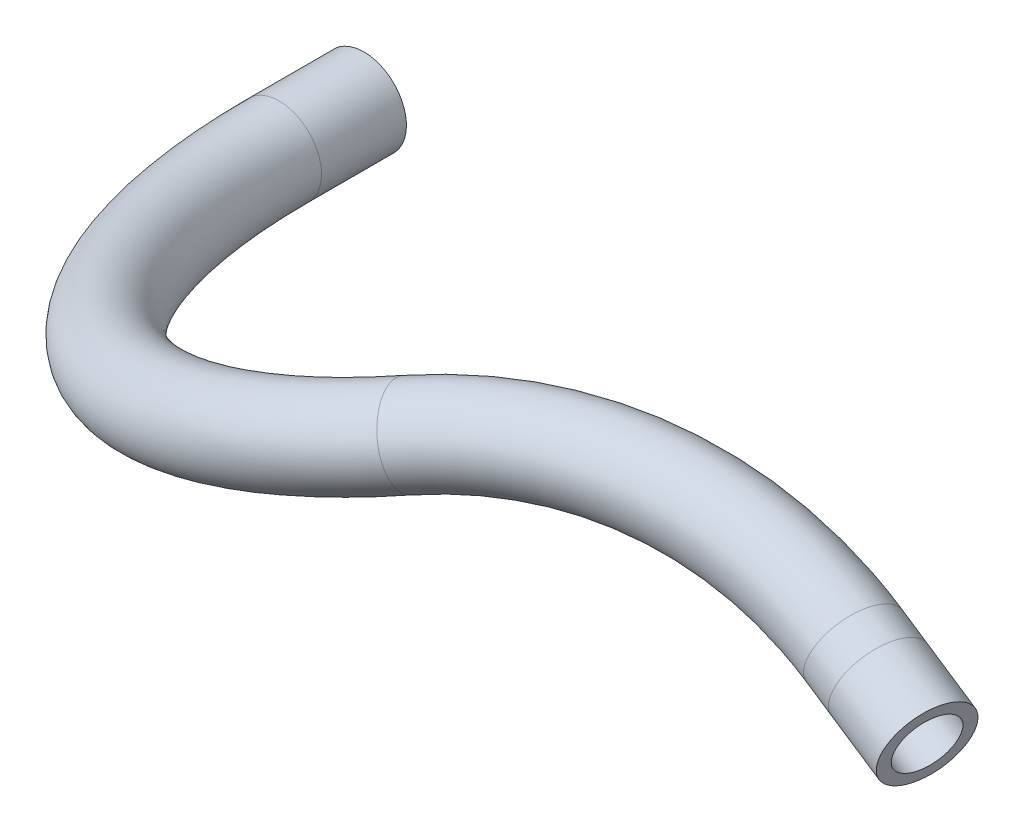
ISO-10303-21;
HEADER;
FILE_DESCRIPTION(('STEP AP214'),'2;1');
FILE_NAME('part.step','',(''),(''),'','','');
FILE_SCHEMA(('AUTOMOTIVE_DESIGN { 1 0 10303 214 1 1 1 1 }'));
ENDSEC;
DATA;
#1=APPLICATION_CONTEXT('core data for automotive mechanical design processes');
#2=APPLICATION_PROTOCOL_DEFINITION('international standard','automotive_design',2000,#1);
#3=PRODUCT_CONTEXT('',#1,'mechanical');
#4=PRODUCT('Part','Part','',(#3));
#5=PRODUCT_RELATED_PRODUCT_CATEGORY('part','',(#4));
#6=PRODUCT_DEFINITION_FORMATION('','',#4);
#7=PRODUCT_DEFINITION_CONTEXT('part definition',#1,'design');
#8=PRODUCT_DEFINITION('design','',#6,#7);
#9=PRODUCT_DEFINITION_SHAPE('','',#8);
#10=(LENGTH_UNIT() NAMED_UNIT(*) SI_UNIT(.MILLI.,.METRE.));
#11=(NAMED_UNIT(*) PLANE_ANGLE_UNIT() SI_UNIT($,.RADIAN.));
#12=(NAMED_UNIT(*) SI_UNIT($,.STERADIAN.) SOLID_ANGLE_UNIT());
#13=UNCERTAINTY_MEASURE_WITH_UNIT(LENGTH_MEASURE(1.E-05),#10,'distance_accuracy_value','');
#14=(GEOMETRIC_REPRESENTATION_CONTEXT(3) GLOBAL_UNCERTAINTY_ASSIGNED_CONTEXT((#13)) GLOBAL_UNIT_ASSIGNED_CONTEXT((#10,
#11,#12)) REPRESENTATION_CONTEXT('',''));
#15=CARTESIAN_POINT('',(0.,0.,0.));
#16=DIRECTION('',(0.,0.,1.));
#17=DIRECTION('',(1.,0.,0.));
#18=AXIS2_PLACEMENT_3D('',#15,#16,#17);
#19=CARTESIAN_POINT('',(23.4999999999999,73.,-26.9999999999999));
#20=DIRECTION('',(0.,0.,-1.));
#21=DIRECTION('',(0.414353258588674,-0.91011613385158,0.));
#22=AXIS2_PLACEMENT_3D('',#19,#20,#21);
#23=PLANE('',#22);
#24=CARTESIAN_POINT('',(23.4999999999999,73.,-26.9999999999999));
#25=DIRECTION('',(0.,0.,-1.));
#26=DIRECTION('',(-1.,0.,0.));
#27=AXIS2_PLACEMENT_3D('',#24,#25,#26);
#28=CIRCLE('',#27,9.525);
#29=CARTESIAN_POINT('',(13.9749999999999,73.,-26.9999999999999));
#30=VERTEX_POINT('',#29);
#31=EDGE_CURVE('E98',#30,#30,#28,.T.);
#32=ORIENTED_EDGE('',*,*,#31,.F.);
#33=EDGE_LOOP('',(#32));
#34=FACE_BOUND('',#33,.T.);
#35=CARTESIAN_POINT('',(23.4999999999999,73.,-26.9999999999999));
#36=DIRECTION('',(0.,0.,-1.));
#37=DIRECTION('',(0.414353258588674,-0.91011613385158,0.));
#38=AXIS2_PLACEMENT_3D('',#35,#36,#37);
#39=CIRCLE('',#38,13.49375);
#40=CARTESIAN_POINT('',(29.0911792830809,60.7191204188402,-26.9999999999999));
#41=VERTEX_POINT('',#40);
#42=EDGE_CURVE('E94',#41,#41,#39,.T.);
#43=ORIENTED_EDGE('',*,*,#42,.T.);
#44=EDGE_LOOP('',(#43));
#45=FACE_BOUND('',#44,.T.);
#46=ADVANCED_FACE('F65',(#34,#45),#23,.T.);
#47=CARTESIAN_POINT('',(342.615480311804,125.391529796908,112.95146684267));
#48=DIRECTION('',(-0.93105033936603,0.315857484412478,-0.182700068711052));
#49=DIRECTION('',(-0.32126478973692,-0.946989405893906,0.));
#50=AXIS2_PLACEMENT_3D('',#47,#48,#49);
#51=PLANE('',#50);
#52=CARTESIAN_POINT('',(342.615480311805,125.391529796908,112.951466842669));
#53=DIRECTION('',(-0.93105033936603,0.315857484412478,-0.182700068711052));
#54=DIRECTION('',(-0.32126478973692,-0.946989405893906,0.));
#55=AXIS2_PLACEMENT_3D('',#52,#53,#54);
#56=CIRCLE('',#55,9.525);
#57=CARTESIAN_POINT('',(339.55543318956,116.371455705768,112.951466842669));
#58=VERTEX_POINT('',#57);
#59=EDGE_CURVE('E102',#58,#58,#56,.T.);
#60=ORIENTED_EDGE('',*,*,#59,.T.);
#61=EDGE_LOOP('',(#60));
#62=FACE_BOUND('',#61,.T.);
#63=CARTESIAN_POINT('',(342.615480311804,125.391529796908,112.95146684267));
#64=DIRECTION('',(-0.93105033936603,0.315857484412478,-0.182700068711052));
#65=DIRECTION('',(-0.32126478973692,-0.946989405893906,0.));
#66=AXIS2_PLACEMENT_3D('',#63,#64,#65);
#67=CIRCLE('',#66,13.49375);
#68=CARTESIAN_POINT('',(338.280413555292,112.613091501127,112.95146684267));
#69=VERTEX_POINT('',#68);
#70=EDGE_CURVE('E11',#69,#69,#67,.T.);
#71=ORIENTED_EDGE('',*,*,#70,.F.);
#72=EDGE_LOOP('',(#71));
#73=FACE_BOUND('',#72,.T.);
#74=ADVANCED_FACE('F124',(#62,#73),#51,.F.);
#75=CARTESIAN_POINT('',(23.4999999999999,73.,-26.9999999999999));
#76=DIRECTION('',(0.,0.,1.));
#77=DIRECTION('',(1.,0.,0.));
#78=AXIS2_PLACEMENT_3D('',#75,#76,#77);
#79=CYLINDRICAL_SURFACE('',#78,13.49375);
#80=CARTESIAN_POINT('',(23.4999999999999,73.,1.11022302462516E-13));
#81=DIRECTION('',(0.,0.,-1.));
#82=DIRECTION('',(0.414353258588674,-0.91011613385158,0.));
#83=AXIS2_PLACEMENT_3D('',#80,#81,#82);
#84=CIRCLE('',#83,13.49375);
#85=CARTESIAN_POINT('',(10.8895858979336,68.1980477681548,1.28862380398844E-13));
#86=VERTEX_POINT('',#85);
#87=EDGE_CURVE('E90',#86,#86,#84,.T.);
#88=ORIENTED_EDGE('',*,*,#87,.T.);
#89=EDGE_LOOP('',(#88));
#90=FACE_BOUND('',#89,.T.);
#91=ORIENTED_EDGE('',*,*,#42,.F.);
#92=EDGE_LOOP('',(#91));
#93=FACE_BOUND('',#92,.T.);
#94=ADVANCED_FACE('F162',(#90,#93),#79,.T.);
#95=CARTESIAN_POINT('',(142.186250372384,118.194844535011,0.));
#96=DIRECTION('',(-0.355864917598515,0.934537404506958,0.));
#97=DIRECTION('',(-0.934537404506958,-0.355864917598515,0.));
#98=AXIS2_PLACEMENT_3D('',#95,#96,#97);
#99=TOROIDAL_SURFACE('',#98,127.000000000001,13.49375);
#100=CARTESIAN_POINT('',(183.3088317353,133.854018750594,119.133217722584));
#101=DIRECTION('',(-0.876649197488387,-0.333821517386558,0.346481426735551));
#102=DIRECTION('',(0.334637321694711,-0.940471371830551,-0.0594261028181365));
#103=AXIS2_PLACEMENT_3D('',#100,#101,#102);
#104=CIRCLE('',#103,13.49375);
#105=CARTESIAN_POINT('',(187.67810600511,135.517806010999,131.791122105608));
#106=VERTEX_POINT('',#105);
#107=EDGE_CURVE('E84',#106,#106,#104,.T.);
#108=CARTESIAN_POINT('',(142.186250372384,118.194844535011,0.));
#109=DIRECTION('',(-0.355864917598515,0.934537404506958,0.));
#110=DIRECTION('',(-0.934537404506958,-0.355864917598515,0.));
#111=AXIS2_PLACEMENT_3D('',#108,#109,#110);
#112=CIRCLE('',#111,140.493750000001);
#113=EDGE_CURVE('',#86,#106,#112,.T.);
#114=ORIENTED_EDGE('',*,*,#87,.F.);
#115=ORIENTED_EDGE('',*,*,#107,.T.);
#116=ORIENTED_EDGE('',*,*,#113,.T.);
#117=ORIENTED_EDGE('',*,*,#113,.F.);
#118=EDGE_LOOP('',(#114,#116,#115,#117));
#119=FACE_BOUND('',#118,.T.);
#120=ADVANCED_FACE('F164',(#119),#99,.T.);
#121=CARTESIAN_POINT('',(257.756919552151,24.8826788716506,202.50818728827));
#122=DIRECTION('',(-0.0635739395554372,-0.633456409006397,-0.771162325388191));
#123=DIRECTION('',(0.,0.772725447660314,-0.634740405629078));
#124=AXIS2_PLACEMENT_3D('',#121,#122,#123);
#125=TOROIDAL_SURFACE('',#124,156.104632361364,13.49375);
#126=CARTESIAN_POINT('',(313.846862770699,135.151241793518,107.306199149561));
#127=DIRECTION('',(-0.93105033936603,0.315857484412478,-0.182700068711052));
#128=DIRECTION('',(-0.32126478973692,-0.946989405893906,0.));
#129=AXIS2_PLACEMENT_3D('',#126,#127,#128);
#130=CIRCLE('',#129,13.49375);
#131=CARTESIAN_POINT('',(309.511796014187,122.372803497737,107.306199149561));
#132=VERTEX_POINT('',#131);
#133=EDGE_CURVE('E78',#132,#132,#130,.T.);
#134=ORIENTED_EDGE('',*,*,#133,.T.);
#135=EDGE_LOOP('',(#134));
#136=FACE_BOUND('',#135,.T.);
#137=ORIENTED_EDGE('',*,*,#107,.F.);
#138=EDGE_LOOP('',(#137));
#139=FACE_BOUND('',#138,.T.);
#140=ADVANCED_FACE('F171',(#136,#139),#125,.T.);
#141=CARTESIAN_POINT('',(313.846862770699,135.151241793518,107.306199149561));
#142=DIRECTION('',(0.931050339366029,-0.315857484412478,0.182700068711052));
#143=DIRECTION('',(0.32126478973692,0.946989405893906,0.));
#144=AXIS2_PLACEMENT_3D('',#141,#142,#143);
#145=CYLINDRICAL_SURFACE('',#144,13.49375);
#146=CARTESIAN_POINT('',(323.696537415887,131.80975388017,109.239001446462));
#147=DIRECTION('',(-0.93105033936603,0.315857484412478,-0.182700068711052));
#148=DIRECTION('',(-0.32126478973692,-0.946989405893906,0.));
#149=AXIS2_PLACEMENT_3D('',#146,#147,#148);
#150=CIRCLE('',#149,13.49375);
#151=CARTESIAN_POINT('',(319.361470659374,119.031315584389,109.239001446462));
#152=VERTEX_POINT('',#151);
#153=EDGE_CURVE('E72',#152,#152,#150,.T.);
#154=ORIENTED_EDGE('',*,*,#153,.T.);
#155=EDGE_LOOP('',(#154));
#156=FACE_BOUND('',#155,.T.);
#157=ORIENTED_EDGE('',*,*,#133,.F.);
#158=EDGE_LOOP('',(#157));
#159=FACE_BOUND('',#158,.T.);
#160=ADVANCED_FACE('F175',(#156,#159),#145,.T.);
#161=CARTESIAN_POINT('',(323.696537415887,131.80975388017,109.239001446462));
#162=DIRECTION('',(0.931050339366029,-0.315857484412477,0.182700068711052));
#163=DIRECTION('',(0.32126478973692,0.946989405893906,0.));
#164=AXIS2_PLACEMENT_3D('',#161,#162,#163);
#165=CYLINDRICAL_SURFACE('',#164,13.49375);
#166=ORIENTED_EDGE('',*,*,#70,.T.);
#167=EDGE_LOOP('',(#166));
#168=FACE_BOUND('',#167,.T.);
#169=ORIENTED_EDGE('',*,*,#153,.F.);
#170=EDGE_LOOP('',(#169));
#171=FACE_BOUND('',#170,.T.);
#172=ADVANCED_FACE('F154',(#168,#171),#165,.T.);
#173=CARTESIAN_POINT('',(23.4999999999999,73.,-32.));
#174=DIRECTION('',(0.,0.,1.));
#175=DIRECTION('',(1.,0.,0.));
#176=AXIS2_PLACEMENT_3D('',#173,#174,#175);
#177=CYLINDRICAL_SURFACE('',#176,9.525);
#178=CARTESIAN_POINT('',(23.4999999999996,72.9999999999999,-1.11022302462516E-13));
#179=DIRECTION('',(0.,0.,-1.));
#180=DIRECTION('',(0.414353258588674,-0.91011613385158,0.));
#181=AXIS2_PLACEMENT_3D('',#178,#179,#180);
#182=CIRCLE('',#181,9.525);
#183=CARTESIAN_POINT('',(14.5985312220706,69.610386659874,-1.15082651641544E-13));
#184=VERTEX_POINT('',#183);
#185=EDGE_CURVE('E103',#184,#184,#182,.T.);
#186=ORIENTED_EDGE('',*,*,#185,.F.);
#187=EDGE_LOOP('',(#186));
#188=FACE_BOUND('',#187,.T.);
#189=ORIENTED_EDGE('',*,*,#31,.T.);
#190=EDGE_LOOP('',(#189));
#191=FACE_BOUND('',#190,.T.);
#192=ADVANCED_FACE('F132',(#188,#191),#177,.F.);
#193=CARTESIAN_POINT('',(142.186250372384,118.194844535011,0.));
#194=DIRECTION('',(-0.355864917598515,0.934537404506958,0.));
#195=DIRECTION('',(-0.934537404506958,-0.355864917598515,0.));
#196=AXIS2_PLACEMENT_3D('',#193,#194,#195);
#197=TOROIDAL_SURFACE('',#196,127.000000000001,9.525);
#198=CARTESIAN_POINT('',(183.3088317353,133.854018750594,119.133217722584));
#199=DIRECTION('',(-0.876649197488388,-0.333821517386558,0.346481426735549));
#200=DIRECTION('',(0.33463732169471,-0.940471371830552,-0.059426102818136));
#201=AXIS2_PLACEMENT_3D('',#198,#199,#200);
#202=CIRCLE('',#201,9.525);
#203=CARTESIAN_POINT('',(186.393025337519,135.028456816762,128.068209051777));
#204=VERTEX_POINT('',#203);
#205=EDGE_CURVE('E107',#204,#204,#202,.T.);
#206=CARTESIAN_POINT('',(142.186250372384,118.194844535011,0.));
#207=DIRECTION('',(-0.355864917598515,0.934537404506958,0.));
#208=DIRECTION('',(-0.934537404506958,-0.355864917598515,0.));
#209=AXIS2_PLACEMENT_3D('',#206,#207,#208);
#210=CIRCLE('',#209,136.525000000001);
#211=EDGE_CURVE('',#184,#204,#210,.T.);
#212=ORIENTED_EDGE('',*,*,#185,.T.);
#213=ORIENTED_EDGE('',*,*,#205,.F.);
#214=ORIENTED_EDGE('',*,*,#211,.T.);
#215=ORIENTED_EDGE('',*,*,#211,.F.);
#216=EDGE_LOOP('',(#212,#214,#213,#215));
#217=FACE_BOUND('',#216,.T.);
#218=ADVANCED_FACE('F143',(#217),#197,.F.);
#219=CARTESIAN_POINT('',(257.756919552151,24.8826788716506,202.50818728827));
#220=DIRECTION('',(-0.0635739395554372,-0.633456409006397,-0.771162325388191));
#221=DIRECTION('',(0.,0.772725447660314,-0.634740405629078));
#222=AXIS2_PLACEMENT_3D('',#219,#220,#221);
#223=TOROIDAL_SURFACE('',#222,156.104632361364,9.525);
#224=CARTESIAN_POINT('',(313.846862770699,135.151241793518,107.30619914956));
#225=DIRECTION('',(-0.93105033936603,0.315857484412478,-0.182700068711052));
#226=DIRECTION('',(-0.32126478973692,-0.946989405893906,0.));
#227=AXIS2_PLACEMENT_3D('',#224,#225,#226);
#228=CIRCLE('',#227,9.525);
#229=CARTESIAN_POINT('',(310.786815648455,126.131167702379,107.30619914956));
#230=VERTEX_POINT('',#229);
#231=EDGE_CURVE('E111',#230,#230,#228,.T.);
#232=ORIENTED_EDGE('',*,*,#231,.F.);
#233=EDGE_LOOP('',(#232));
#234=FACE_BOUND('',#233,.T.);
#235=ORIENTED_EDGE('',*,*,#205,.T.);
#236=EDGE_LOOP('',(#235));
#237=FACE_BOUND('',#236,.T.);
#238=ADVANCED_FACE('F137',(#234,#237),#223,.F.);
#239=CARTESIAN_POINT('',(313.846862770699,135.151241793518,107.30619914956));
#240=DIRECTION('',(0.931050339366029,-0.315857484412478,0.182700068711052));
#241=DIRECTION('',(0.32126478973692,0.946989405893906,0.));
#242=AXIS2_PLACEMENT_3D('',#239,#240,#241);
#243=CYLINDRICAL_SURFACE('',#242,9.525);
#244=CARTESIAN_POINT('',(323.696537415887,131.80975388017,109.239001446461));
#245=DIRECTION('',(-0.93105033936603,0.315857484412478,-0.182700068711052));
#246=DIRECTION('',(-0.32126478973692,-0.946989405893906,0.));
#247=AXIS2_PLACEMENT_3D('',#244,#245,#246);
#248=CIRCLE('',#247,9.525);
#249=CARTESIAN_POINT('',(320.636490293642,122.789679789031,109.239001446461));
#250=VERTEX_POINT('',#249);
#251=EDGE_CURVE('E115',#250,#250,#248,.T.);
#252=ORIENTED_EDGE('',*,*,#251,.F.);
#253=EDGE_LOOP('',(#252));
#254=FACE_BOUND('',#253,.T.);
#255=ORIENTED_EDGE('',*,*,#231,.T.);
#256=EDGE_LOOP('',(#255));
#257=FACE_BOUND('',#256,.T.);
#258=ADVANCED_FACE('F130',(#254,#257),#243,.F.);
#259=CARTESIAN_POINT('',(323.696537415887,131.809753880169,109.239001446461));
#260=DIRECTION('',(0.931050339366029,-0.315857484412477,0.182700068711052));
#261=DIRECTION('',(0.32126478973692,0.946989405893906,0.));
#262=AXIS2_PLACEMENT_3D('',#259,#260,#261);
#263=CYLINDRICAL_SURFACE('',#262,9.525);
#264=ORIENTED_EDGE('',*,*,#59,.F.);
#265=EDGE_LOOP('',(#264));
#266=FACE_BOUND('',#265,.T.);
#267=ORIENTED_EDGE('',*,*,#251,.T.);
#268=EDGE_LOOP('',(#267));
#269=FACE_BOUND('',#268,.T.);
#270=ADVANCED_FACE('F127',(#266,#269),#263,.F.);
#271=CLOSED_SHELL('',(#46,#74,#94,#120,#140,#160,#172,#192,#218,#238,#258,#270));
#272=MANIFOLD_SOLID_BREP('B2',#271);
#273=ADVANCED_BREP_SHAPE_REPRESENTATION('',(#18,#272),#14);
#274=SHAPE_DEFINITION_REPRESENTATION(#9,#273);
ENDSEC;
END-ISO-10303-21;
